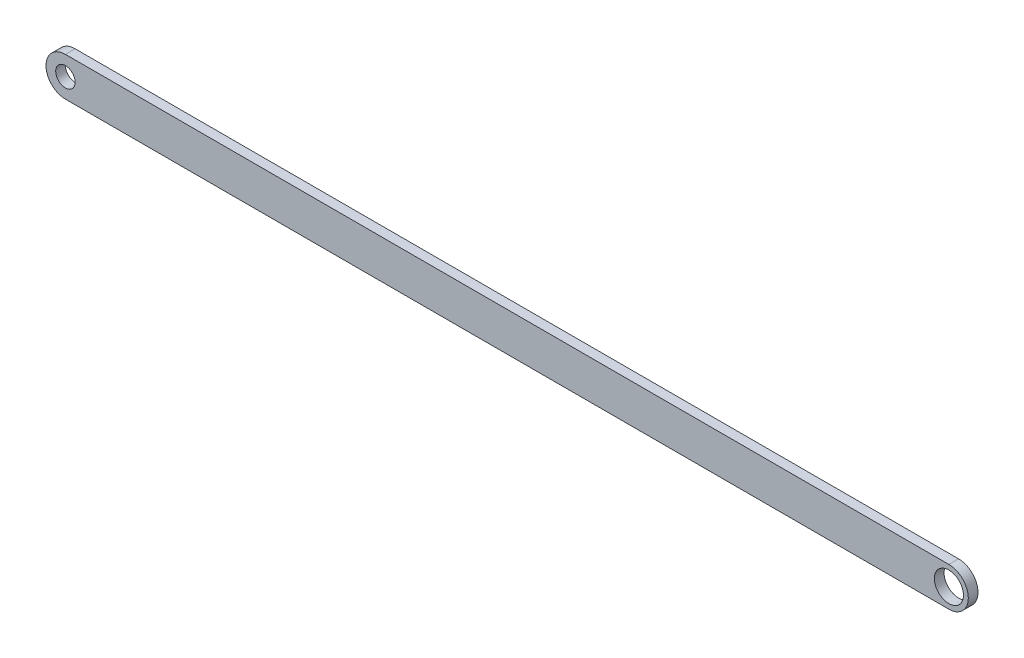
ISO-10303-21;
HEADER;
FILE_DESCRIPTION(('STEP AP214'),'2;1');
FILE_NAME('part.step','',(''),(''),'','','');
FILE_SCHEMA(('AUTOMOTIVE_DESIGN { 1 0 10303 214 1 1 1 1 }'));
ENDSEC;
DATA;
#1=APPLICATION_CONTEXT('core data for automotive mechanical design processes');
#2=APPLICATION_PROTOCOL_DEFINITION('international standard','automotive_design',2000,#1);
#3=PRODUCT_CONTEXT('',#1,'mechanical');
#4=PRODUCT('Part','Part','',(#3));
#5=PRODUCT_RELATED_PRODUCT_CATEGORY('part','',(#4));
#6=PRODUCT_DEFINITION_FORMATION('','',#4);
#7=PRODUCT_DEFINITION_CONTEXT('part definition',#1,'design');
#8=PRODUCT_DEFINITION('design','',#6,#7);
#9=PRODUCT_DEFINITION_SHAPE('','',#8);
#10=(LENGTH_UNIT() NAMED_UNIT(*) SI_UNIT(.MILLI.,.METRE.));
#11=(NAMED_UNIT(*) PLANE_ANGLE_UNIT() SI_UNIT($,.RADIAN.));
#12=(NAMED_UNIT(*) SI_UNIT($,.STERADIAN.) SOLID_ANGLE_UNIT());
#13=UNCERTAINTY_MEASURE_WITH_UNIT(LENGTH_MEASURE(1.E-05),#10,'distance_accuracy_value','');
#14=(GEOMETRIC_REPRESENTATION_CONTEXT(3) GLOBAL_UNCERTAINTY_ASSIGNED_CONTEXT((#13)) GLOBAL_UNIT_ASSIGNED_CONTEXT((#10,
#11,#12)) REPRESENTATION_CONTEXT('',''));
#15=CARTESIAN_POINT('',(0.,0.,0.));
#16=DIRECTION('',(0.,0.,1.));
#17=DIRECTION('',(1.,0.,0.));
#18=AXIS2_PLACEMENT_3D('',#15,#16,#17);
#19=CARTESIAN_POINT('',(45.545,0.,1.));
#20=DIRECTION('',(0.,0.,-1.));
#21=DIRECTION('',(-1.,0.,0.));
#22=AXIS2_PLACEMENT_3D('',#19,#20,#21);
#23=PLANE('',#22);
#24=CARTESIAN_POINT('',(45.545,0.,1.));
#25=DIRECTION('',(0.,0.,1.));
#26=DIRECTION('',(-1.,0.,0.));
#27=AXIS2_PLACEMENT_3D('',#24,#25,#26);
#28=CIRCLE('',#27,2.);
#29=CARTESIAN_POINT('',(45.545,-2.,1.));
#30=VERTEX_POINT('',#29);
#31=CARTESIAN_POINT('',(45.545,2.,1.));
#32=VERTEX_POINT('',#31);
#33=EDGE_CURVE('E89',#30,#32,#28,.T.);
#34=ORIENTED_EDGE('',*,*,#33,.T.);
#35=DIRECTION('',(-1.,0.,0.));
#36=VECTOR('',#35,1.);
#37=CARTESIAN_POINT('',(-45.545,2.,1.));
#38=LINE('',#37,#36);
#39=CARTESIAN_POINT('',(-45.545,2.,1.));
#40=VERTEX_POINT('',#39);
#41=EDGE_CURVE('E84',#32,#40,#38,.T.);
#42=ORIENTED_EDGE('',*,*,#41,.T.);
#43=CARTESIAN_POINT('',(-45.545,0.,1.));
#44=DIRECTION('',(0.,0.,1.));
#45=DIRECTION('',(1.,0.,0.));
#46=AXIS2_PLACEMENT_3D('',#43,#44,#45);
#47=CIRCLE('',#46,2.);
#48=CARTESIAN_POINT('',(-45.545,-2.,1.));
#49=VERTEX_POINT('',#48);
#50=EDGE_CURVE('E87',#40,#49,#47,.T.);
#51=ORIENTED_EDGE('',*,*,#50,.T.);
#52=DIRECTION('',(1.,0.,0.));
#53=VECTOR('',#52,1.);
#54=CARTESIAN_POINT('',(-45.545,-2.,1.));
#55=LINE('',#54,#53);
#56=EDGE_CURVE('E54',#49,#30,#55,.T.);
#57=ORIENTED_EDGE('',*,*,#56,.T.);
#58=EDGE_LOOP('',(#34,#42,#51,#57));
#59=FACE_BOUND('',#58,.T.);
#60=CARTESIAN_POINT('',(45.545,0.,1.));
#61=DIRECTION('',(0.,0.,1.));
#62=DIRECTION('',(1.,0.,0.));
#63=AXIS2_PLACEMENT_3D('',#60,#61,#62);
#64=CIRCLE('',#63,1.5);
#65=CARTESIAN_POINT('',(47.045,0.,1.));
#66=VERTEX_POINT('',#65);
#67=EDGE_CURVE('E104',#66,#66,#64,.T.);
#68=ORIENTED_EDGE('',*,*,#67,.F.);
#69=EDGE_LOOP('',(#68));
#70=FACE_BOUND('',#69,.T.);
#71=CARTESIAN_POINT('',(-45.545,0.,1.));
#72=DIRECTION('',(0.,0.,1.));
#73=DIRECTION('',(1.,0.,0.));
#74=AXIS2_PLACEMENT_3D('',#71,#72,#73);
#75=CIRCLE('',#74,0.999999999999998);
#76=CARTESIAN_POINT('',(-44.545,0.,1.));
#77=VERTEX_POINT('',#76);
#78=EDGE_CURVE('E119',#77,#77,#75,.T.);
#79=ORIENTED_EDGE('',*,*,#78,.F.);
#80=EDGE_LOOP('',(#79));
#81=FACE_BOUND('',#80,.T.);
#82=ADVANCED_FACE('F37',(#59,#70,#81),#23,.F.);
#83=CARTESIAN_POINT('',(45.545,0.,0.));
#84=DIRECTION('',(0.,0.,-1.));
#85=DIRECTION('',(-1.,0.,0.));
#86=AXIS2_PLACEMENT_3D('',#83,#84,#85);
#87=PLANE('',#86);
#88=CARTESIAN_POINT('',(45.545,0.,0.));
#89=DIRECTION('',(0.,0.,1.));
#90=DIRECTION('',(1.,0.,0.));
#91=AXIS2_PLACEMENT_3D('',#88,#89,#90);
#92=CIRCLE('',#91,1.5);
#93=CARTESIAN_POINT('',(47.045,0.,0.));
#94=VERTEX_POINT('',#93);
#95=EDGE_CURVE('E116',#94,#94,#92,.T.);
#96=ORIENTED_EDGE('',*,*,#95,.T.);
#97=EDGE_LOOP('',(#96));
#98=FACE_BOUND('',#97,.T.);
#99=CARTESIAN_POINT('',(45.545,0.,0.));
#100=DIRECTION('',(0.,0.,1.));
#101=DIRECTION('',(-1.,0.,0.));
#102=AXIS2_PLACEMENT_3D('',#99,#100,#101);
#103=CIRCLE('',#102,2.);
#104=CARTESIAN_POINT('',(45.545,-2.,0.));
#105=VERTEX_POINT('',#104);
#106=CARTESIAN_POINT('',(45.545,2.,0.));
#107=VERTEX_POINT('',#106);
#108=EDGE_CURVE('E101',#105,#107,#103,.T.);
#109=ORIENTED_EDGE('',*,*,#108,.F.);
#110=DIRECTION('',(1.,0.,0.));
#111=VECTOR('',#110,1.);
#112=CARTESIAN_POINT('',(-45.545,-2.,0.));
#113=LINE('',#112,#111);
#114=CARTESIAN_POINT('',(-45.545,-2.,0.));
#115=VERTEX_POINT('',#114);
#116=EDGE_CURVE('E77',#115,#105,#113,.T.);
#117=ORIENTED_EDGE('',*,*,#116,.F.);
#118=CARTESIAN_POINT('',(-45.545,0.,0.));
#119=DIRECTION('',(0.,0.,1.));
#120=DIRECTION('',(1.,0.,0.));
#121=AXIS2_PLACEMENT_3D('',#118,#119,#120);
#122=CIRCLE('',#121,2.);
#123=CARTESIAN_POINT('',(-45.545,2.,0.));
#124=VERTEX_POINT('',#123);
#125=EDGE_CURVE('E71',#124,#115,#122,.T.);
#126=ORIENTED_EDGE('',*,*,#125,.F.);
#127=DIRECTION('',(-1.,0.,0.));
#128=VECTOR('',#127,1.);
#129=CARTESIAN_POINT('',(-45.545,2.,0.));
#130=LINE('',#129,#128);
#131=EDGE_CURVE('E93',#107,#124,#130,.T.);
#132=ORIENTED_EDGE('',*,*,#131,.F.);
#133=EDGE_LOOP('',(#109,#117,#126,#132));
#134=FACE_BOUND('',#133,.T.);
#135=CARTESIAN_POINT('',(-45.545,0.,0.));
#136=DIRECTION('',(0.,0.,1.));
#137=DIRECTION('',(1.,0.,0.));
#138=AXIS2_PLACEMENT_3D('',#135,#136,#137);
#139=CIRCLE('',#138,0.999999999999998);
#140=CARTESIAN_POINT('',(-44.545,0.,0.));
#141=VERTEX_POINT('',#140);
#142=EDGE_CURVE('E122',#141,#141,#139,.T.);
#143=ORIENTED_EDGE('',*,*,#142,.T.);
#144=EDGE_LOOP('',(#143));
#145=FACE_BOUND('',#144,.T.);
#146=ADVANCED_FACE('F112',(#98,#134,#145),#87,.T.);
#147=CARTESIAN_POINT('',(45.545,0.,1.));
#148=DIRECTION('',(0.,0.,-1.));
#149=DIRECTION('',(-1.,0.,0.));
#150=AXIS2_PLACEMENT_3D('',#147,#148,#149);
#151=CYLINDRICAL_SURFACE('',#150,2.);
#152=ORIENTED_EDGE('',*,*,#108,.T.);
#153=DIRECTION('',(0.,0.,-1.));
#154=VECTOR('',#153,1.);
#155=CARTESIAN_POINT('',(45.545,2.,1.));
#156=LINE('',#155,#154);
#157=EDGE_CURVE('E11',#32,#107,#156,.T.);
#158=ORIENTED_EDGE('',*,*,#157,.F.);
#159=ORIENTED_EDGE('',*,*,#33,.F.);
#160=DIRECTION('',(0.,0.,-1.));
#161=VECTOR('',#160,1.);
#162=CARTESIAN_POINT('',(45.545,-2.,1.));
#163=LINE('',#162,#161);
#164=EDGE_CURVE('E97',#30,#105,#163,.T.);
#165=ORIENTED_EDGE('',*,*,#164,.T.);
#166=EDGE_LOOP('',(#152,#158,#159,#165));
#167=FACE_BOUND('',#166,.T.);
#168=ADVANCED_FACE('F39',(#167),#151,.T.);
#169=CARTESIAN_POINT('',(-45.545,2.,1.));
#170=DIRECTION('',(0.,-1.,0.));
#171=DIRECTION('',(0.,0.,-1.));
#172=AXIS2_PLACEMENT_3D('',#169,#170,#171);
#173=PLANE('',#172);
#174=ORIENTED_EDGE('',*,*,#131,.T.);
#175=DIRECTION('',(0.,0.,-1.));
#176=VECTOR('',#175,1.);
#177=CARTESIAN_POINT('',(-45.545,2.,1.));
#178=LINE('',#177,#176);
#179=EDGE_CURVE('E46',#40,#124,#178,.T.);
#180=ORIENTED_EDGE('',*,*,#179,.F.);
#181=ORIENTED_EDGE('',*,*,#41,.F.);
#182=ORIENTED_EDGE('',*,*,#157,.T.);
#183=EDGE_LOOP('',(#174,#180,#181,#182));
#184=FACE_BOUND('',#183,.T.);
#185=ADVANCED_FACE('F92',(#184),#173,.F.);
#186=CARTESIAN_POINT('',(-45.545,0.,1.));
#187=DIRECTION('',(0.,0.,-1.));
#188=DIRECTION('',(-1.,0.,0.));
#189=AXIS2_PLACEMENT_3D('',#186,#187,#188);
#190=CYLINDRICAL_SURFACE('',#189,2.);
#191=ORIENTED_EDGE('',*,*,#125,.T.);
#192=DIRECTION('',(0.,0.,-1.));
#193=VECTOR('',#192,1.);
#194=CARTESIAN_POINT('',(-45.545,-2.,1.));
#195=LINE('',#194,#193);
#196=EDGE_CURVE('E94',#49,#115,#195,.T.);
#197=ORIENTED_EDGE('',*,*,#196,.F.);
#198=ORIENTED_EDGE('',*,*,#50,.F.);
#199=ORIENTED_EDGE('',*,*,#179,.T.);
#200=EDGE_LOOP('',(#191,#197,#198,#199));
#201=FACE_BOUND('',#200,.T.);
#202=ADVANCED_FACE('F95',(#201),#190,.T.);
#203=CARTESIAN_POINT('',(-45.545,-2.,1.));
#204=DIRECTION('',(0.,1.,0.));
#205=DIRECTION('',(0.,0.,1.));
#206=AXIS2_PLACEMENT_3D('',#203,#204,#205);
#207=PLANE('',#206);
#208=ORIENTED_EDGE('',*,*,#116,.T.);
#209=ORIENTED_EDGE('',*,*,#164,.F.);
#210=ORIENTED_EDGE('',*,*,#56,.F.);
#211=ORIENTED_EDGE('',*,*,#196,.T.);
#212=EDGE_LOOP('',(#208,#209,#210,#211));
#213=FACE_BOUND('',#212,.T.);
#214=ADVANCED_FACE('F109',(#213),#207,.F.);
#215=CARTESIAN_POINT('',(45.545,0.,1.));
#216=DIRECTION('',(0.,0.,-1.));
#217=DIRECTION('',(-1.,0.,0.));
#218=AXIS2_PLACEMENT_3D('',#215,#216,#217);
#219=CYLINDRICAL_SURFACE('',#218,1.5);
#220=ORIENTED_EDGE('',*,*,#67,.T.);
#221=EDGE_LOOP('',(#220));
#222=FACE_BOUND('',#221,.T.);
#223=ORIENTED_EDGE('',*,*,#95,.F.);
#224=EDGE_LOOP('',(#223));
#225=FACE_BOUND('',#224,.T.);
#226=ADVANCED_FACE('F139',(#222,#225),#219,.F.);
#227=CARTESIAN_POINT('',(-45.545,0.,1.));
#228=DIRECTION('',(0.,0.,-1.));
#229=DIRECTION('',(-1.,0.,0.));
#230=AXIS2_PLACEMENT_3D('',#227,#228,#229);
#231=CYLINDRICAL_SURFACE('',#230,0.999999999999998);
#232=ORIENTED_EDGE('',*,*,#78,.T.);
#233=EDGE_LOOP('',(#232));
#234=FACE_BOUND('',#233,.T.);
#235=ORIENTED_EDGE('',*,*,#142,.F.);
#236=EDGE_LOOP('',(#235));
#237=FACE_BOUND('',#236,.T.);
#238=ADVANCED_FACE('F128',(#234,#237),#231,.F.);
#239=CLOSED_SHELL('',(#82,#146,#168,#185,#202,#214,#226,#238));
#240=MANIFOLD_SOLID_BREP('B2',#239);
#241=ADVANCED_BREP_SHAPE_REPRESENTATION('',(#18,#240),#14);
#242=SHAPE_DEFINITION_REPRESENTATION(#9,#241);
ENDSEC;
END-ISO-10303-21;
